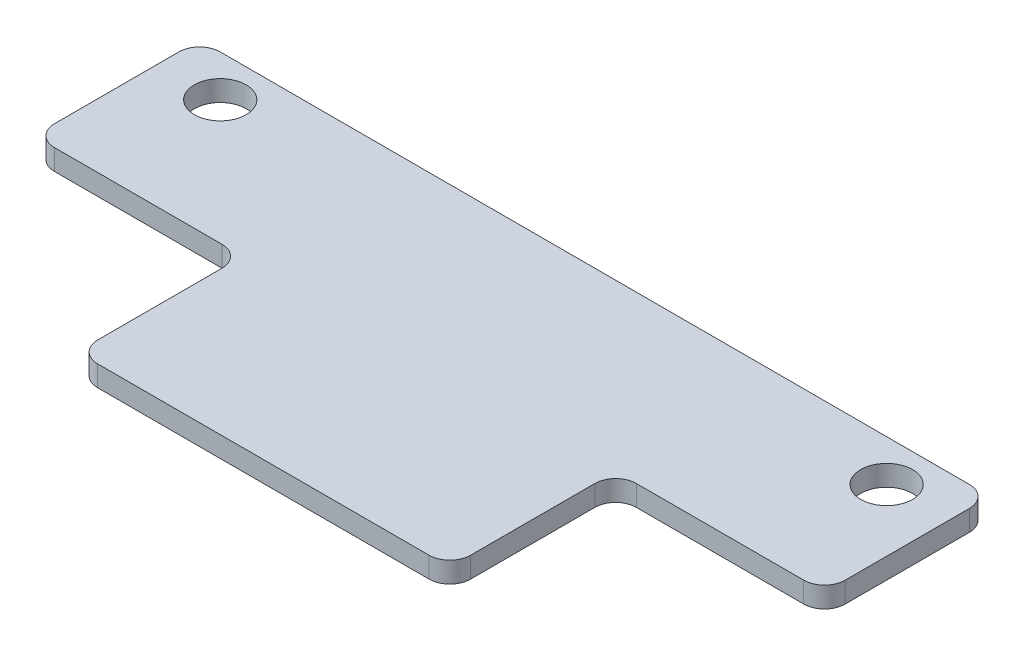
ISO-10303-21;
HEADER;
FILE_DESCRIPTION(('STEP AP214'),'2;1');
FILE_NAME('part.step','',(''),(''),'','','');
FILE_SCHEMA(('AUTOMOTIVE_DESIGN { 1 0 10303 214 1 1 1 1 }'));
ENDSEC;
DATA;
#1=APPLICATION_CONTEXT('core data for automotive mechanical design processes');
#2=APPLICATION_PROTOCOL_DEFINITION('international standard','automotive_design',2000,#1);
#3=PRODUCT_CONTEXT('',#1,'mechanical');
#4=PRODUCT('Part','Part','',(#3));
#5=PRODUCT_RELATED_PRODUCT_CATEGORY('part','',(#4));
#6=PRODUCT_DEFINITION_FORMATION('','',#4);
#7=PRODUCT_DEFINITION_CONTEXT('part definition',#1,'design');
#8=PRODUCT_DEFINITION('design','',#6,#7);
#9=PRODUCT_DEFINITION_SHAPE('','',#8);
#10=(LENGTH_UNIT() NAMED_UNIT(*) SI_UNIT(.MILLI.,.METRE.));
#11=(NAMED_UNIT(*) PLANE_ANGLE_UNIT() SI_UNIT($,.RADIAN.));
#12=(NAMED_UNIT(*) SI_UNIT($,.STERADIAN.) SOLID_ANGLE_UNIT());
#13=UNCERTAINTY_MEASURE_WITH_UNIT(LENGTH_MEASURE(1.E-05),#10,'distance_accuracy_value','');
#14=(GEOMETRIC_REPRESENTATION_CONTEXT(3) GLOBAL_UNCERTAINTY_ASSIGNED_CONTEXT((#13)) GLOBAL_UNIT_ASSIGNED_CONTEXT((#10,
#11,#12)) REPRESENTATION_CONTEXT('',''));
#15=CARTESIAN_POINT('',(0.,0.,0.));
#16=DIRECTION('',(0.,0.,1.));
#17=DIRECTION('',(1.,0.,0.));
#18=AXIS2_PLACEMENT_3D('',#15,#16,#17);
#19=CARTESIAN_POINT('',(0.,3.175,101.6));
#20=DIRECTION('',(0.,0.,-1.));
#21=DIRECTION('',(-1.,0.,0.));
#22=AXIS2_PLACEMENT_3D('',#19,#20,#21);
#23=PLANE('',#22);
#24=DIRECTION('',(1.,0.,0.));
#25=VECTOR('',#24,1.);
#26=CARTESIAN_POINT('',(0.,-3.175,101.6));
#27=LINE('',#26,#25);
#28=CARTESIAN_POINT('',(-50.8000000000245,-3.175,101.6));
#29=VERTEX_POINT('',#28);
#30=CARTESIAN_POINT('',(50.7999999999755,-3.175,101.6));
#31=VERTEX_POINT('',#30);
#32=EDGE_CURVE('E288',#29,#31,#27,.T.);
#33=ORIENTED_EDGE('',*,*,#32,.T.);
#34=DIRECTION('',(0.,1.,0.));
#35=VECTOR('',#34,1.);
#36=CARTESIAN_POINT('',(50.7999999999755,3.175,101.6));
#37=LINE('',#36,#35);
#38=CARTESIAN_POINT('',(50.7999999999755,3.175,101.6));
#39=VERTEX_POINT('',#38);
#40=EDGE_CURVE('E169',#31,#39,#37,.T.);
#41=ORIENTED_EDGE('',*,*,#40,.T.);
#42=DIRECTION('',(1.,0.,0.));
#43=VECTOR('',#42,1.);
#44=CARTESIAN_POINT('',(0.,3.175,101.6));
#45=LINE('',#44,#43);
#46=CARTESIAN_POINT('',(-50.8000000000245,3.175,101.6));
#47=VERTEX_POINT('',#46);
#48=EDGE_CURVE('E153',#47,#39,#45,.T.);
#49=ORIENTED_EDGE('',*,*,#48,.F.);
#50=DIRECTION('',(0.,1.,0.));
#51=VECTOR('',#50,1.);
#52=CARTESIAN_POINT('',(-50.8000000000245,3.175,101.6));
#53=LINE('',#52,#51);
#54=EDGE_CURVE('E166',#47,#29,#53,.F.);
#55=ORIENTED_EDGE('',*,*,#54,.T.);
#56=EDGE_LOOP('',(#33,#41,#49,#55));
#57=FACE_BOUND('',#56,.T.);
#58=ADVANCED_FACE('F35',(#57),#23,.F.);
#59=CARTESIAN_POINT('',(121.18154967239,3.175,0.));
#60=DIRECTION('',(1.,0.,0.));
#61=DIRECTION('',(0.,0.,-1.));
#62=AXIS2_PLACEMENT_3D('',#59,#60,#61);
#63=PLANE('',#62);
#64=DIRECTION('',(0.,0.,1.));
#65=VECTOR('',#64,1.);
#66=CARTESIAN_POINT('',(121.18154967239,-3.175,0.));
#67=LINE('',#66,#65);
#68=CARTESIAN_POINT('',(121.18154967239,-3.175,6.35));
#69=VERTEX_POINT('',#68);
#70=CARTESIAN_POINT('',(121.18154967239,-3.175,44.45));
#71=VERTEX_POINT('',#70);
#72=EDGE_CURVE('E290',#69,#71,#67,.T.);
#73=ORIENTED_EDGE('',*,*,#72,.F.);
#74=DIRECTION('',(0.,-1.,0.));
#75=VECTOR('',#74,1.);
#76=CARTESIAN_POINT('',(121.18154967239,3.175,6.35));
#77=LINE('',#76,#75);
#78=CARTESIAN_POINT('',(121.18154967239,3.175,6.35));
#79=VERTEX_POINT('',#78);
#80=EDGE_CURVE('E231',#69,#79,#77,.F.);
#81=ORIENTED_EDGE('',*,*,#80,.T.);
#82=DIRECTION('',(0.,0.,1.));
#83=VECTOR('',#82,1.);
#84=CARTESIAN_POINT('',(121.18154967239,3.175,0.));
#85=LINE('',#84,#83);
#86=CARTESIAN_POINT('',(121.18154967239,3.175,44.45));
#87=VERTEX_POINT('',#86);
#88=EDGE_CURVE('E170',#79,#87,#85,.T.);
#89=ORIENTED_EDGE('',*,*,#88,.T.);
#90=DIRECTION('',(0.,1.,0.));
#91=VECTOR('',#90,1.);
#92=CARTESIAN_POINT('',(121.18154967239,-3.175,44.45));
#93=LINE('',#92,#91);
#94=EDGE_CURVE('E229',#87,#71,#93,.F.);
#95=ORIENTED_EDGE('',*,*,#94,.T.);
#96=EDGE_LOOP('',(#73,#81,#89,#95));
#97=FACE_BOUND('',#96,.T.);
#98=ADVANCED_FACE('F314',(#97),#63,.T.);
#99=CARTESIAN_POINT('',(0.,3.175,0.));
#100=DIRECTION('',(0.,0.,-1.));
#101=DIRECTION('',(-1.,0.,0.));
#102=AXIS2_PLACEMENT_3D('',#99,#100,#101);
#103=PLANE('',#102);
#104=DIRECTION('',(1.,0.,0.));
#105=VECTOR('',#104,1.);
#106=CARTESIAN_POINT('',(0.,3.175,0.));
#107=LINE('',#106,#105);
#108=CARTESIAN_POINT('',(-114.83154967239,3.175,0.));
#109=VERTEX_POINT('',#108);
#110=CARTESIAN_POINT('',(114.83154967239,3.175,0.));
#111=VERTEX_POINT('',#110);
#112=EDGE_CURVE('E281',#109,#111,#107,.T.);
#113=ORIENTED_EDGE('',*,*,#112,.T.);
#114=DIRECTION('',(0.,-1.,0.));
#115=VECTOR('',#114,1.);
#116=CARTESIAN_POINT('',(114.83154967239,3.175,0.));
#117=LINE('',#116,#115);
#118=CARTESIAN_POINT('',(114.83154967239,-3.175,0.));
#119=VERTEX_POINT('',#118);
#120=EDGE_CURVE('E226',#111,#119,#117,.T.);
#121=ORIENTED_EDGE('',*,*,#120,.T.);
#122=DIRECTION('',(1.,0.,0.));
#123=VECTOR('',#122,1.);
#124=CARTESIAN_POINT('',(0.,-3.175,0.));
#125=LINE('',#124,#123);
#126=CARTESIAN_POINT('',(-114.83154967239,-3.175,0.));
#127=VERTEX_POINT('',#126);
#128=EDGE_CURVE('E292',#127,#119,#125,.T.);
#129=ORIENTED_EDGE('',*,*,#128,.F.);
#130=DIRECTION('',(0.,-1.,0.));
#131=VECTOR('',#130,1.);
#132=CARTESIAN_POINT('',(-114.83154967239,3.175,0.));
#133=LINE('',#132,#131);
#134=EDGE_CURVE('E224',#127,#109,#133,.F.);
#135=ORIENTED_EDGE('',*,*,#134,.T.);
#136=EDGE_LOOP('',(#113,#121,#129,#135));
#137=FACE_BOUND('',#136,.T.);
#138=ADVANCED_FACE('F319',(#137),#103,.T.);
#139=CARTESIAN_POINT('',(-121.18154967239,3.175,0.));
#140=DIRECTION('',(1.,0.,0.));
#141=DIRECTION('',(0.,0.,-1.));
#142=AXIS2_PLACEMENT_3D('',#139,#140,#141);
#143=PLANE('',#142);
#144=DIRECTION('',(0.,0.,1.));
#145=VECTOR('',#144,1.);
#146=CARTESIAN_POINT('',(-121.18154967239,-3.175,0.));
#147=LINE('',#146,#145);
#148=CARTESIAN_POINT('',(-121.18154967239,-3.175,6.35));
#149=VERTEX_POINT('',#148);
#150=CARTESIAN_POINT('',(-121.18154967239,-3.175,44.45));
#151=VERTEX_POINT('',#150);
#152=EDGE_CURVE('E294',#149,#151,#147,.T.);
#153=ORIENTED_EDGE('',*,*,#152,.T.);
#154=DIRECTION('',(0.,1.,0.));
#155=VECTOR('',#154,1.);
#156=CARTESIAN_POINT('',(-121.18154967239,3.175,44.45));
#157=LINE('',#156,#155);
#158=CARTESIAN_POINT('',(-121.18154967239,3.175,44.45));
#159=VERTEX_POINT('',#158);
#160=EDGE_CURVE('E221',#151,#159,#157,.T.);
#161=ORIENTED_EDGE('',*,*,#160,.T.);
#162=DIRECTION('',(0.,0.,1.));
#163=VECTOR('',#162,1.);
#164=CARTESIAN_POINT('',(-121.18154967239,3.175,0.));
#165=LINE('',#164,#163);
#166=CARTESIAN_POINT('',(-121.18154967239,3.175,6.35));
#167=VERTEX_POINT('',#166);
#168=EDGE_CURVE('E181',#167,#159,#165,.T.);
#169=ORIENTED_EDGE('',*,*,#168,.F.);
#170=DIRECTION('',(0.,-1.,0.));
#171=VECTOR('',#170,1.);
#172=CARTESIAN_POINT('',(-121.18154967239,-3.175,6.35));
#173=LINE('',#172,#171);
#174=EDGE_CURVE('E218',#167,#149,#173,.T.);
#175=ORIENTED_EDGE('',*,*,#174,.T.);
#176=EDGE_LOOP('',(#153,#161,#169,#175));
#177=FACE_BOUND('',#176,.T.);
#178=ADVANCED_FACE('F327',(#177),#143,.F.);
#179=CARTESIAN_POINT('',(-102.13154967239,3.175,12.7));
#180=DIRECTION('',(0.,-1.,0.));
#181=DIRECTION('',(0.,0.,-1.));
#182=AXIS2_PLACEMENT_3D('',#179,#180,#181);
#183=CYLINDRICAL_SURFACE('',#182,7.93749999999999);
#184=CARTESIAN_POINT('',(-102.13154967239,3.175,12.7));
#185=DIRECTION('',(0.,1.,0.));
#186=DIRECTION('',(0.,0.,1.));
#187=AXIS2_PLACEMENT_3D('',#184,#185,#186);
#188=CIRCLE('',#187,7.93749999999999);
#189=CARTESIAN_POINT('',(-102.13154967239,3.175,20.6375));
#190=VERTEX_POINT('',#189);
#191=EDGE_CURVE('E171',#190,#190,#188,.T.);
#192=ORIENTED_EDGE('',*,*,#191,.T.);
#193=EDGE_LOOP('',(#192));
#194=FACE_BOUND('',#193,.T.);
#195=CARTESIAN_POINT('',(-102.13154967239,-3.175,12.7));
#196=DIRECTION('',(0.,1.,0.));
#197=DIRECTION('',(0.,0.,1.));
#198=AXIS2_PLACEMENT_3D('',#195,#196,#197);
#199=CIRCLE('',#198,7.93749999999999);
#200=CARTESIAN_POINT('',(-102.13154967239,-3.175,20.6375));
#201=VERTEX_POINT('',#200);
#202=EDGE_CURVE('E273',#201,#201,#199,.T.);
#203=ORIENTED_EDGE('',*,*,#202,.F.);
#204=EDGE_LOOP('',(#203));
#205=FACE_BOUND('',#204,.T.);
#206=ADVANCED_FACE('F324',(#194,#205),#183,.F.);
#207=CARTESIAN_POINT('',(102.13154967239,3.175,12.7));
#208=DIRECTION('',(0.,-1.,0.));
#209=DIRECTION('',(0.,0.,-1.));
#210=AXIS2_PLACEMENT_3D('',#207,#208,#209);
#211=CYLINDRICAL_SURFACE('',#210,7.93749999999999);
#212=CARTESIAN_POINT('',(102.13154967239,3.175,12.7));
#213=DIRECTION('',(0.,1.,0.));
#214=DIRECTION('',(0.,0.,1.));
#215=AXIS2_PLACEMENT_3D('',#212,#213,#214);
#216=CIRCLE('',#215,7.93749999999999);
#217=CARTESIAN_POINT('',(102.13154967239,3.175,20.6375));
#218=VERTEX_POINT('',#217);
#219=EDGE_CURVE('E176',#218,#218,#216,.F.);
#220=ORIENTED_EDGE('',*,*,#219,.F.);
#221=EDGE_LOOP('',(#220));
#222=FACE_BOUND('',#221,.T.);
#223=CARTESIAN_POINT('',(102.13154967239,-3.175,12.7));
#224=DIRECTION('',(0.,1.,0.));
#225=DIRECTION('',(0.,0.,1.));
#226=AXIS2_PLACEMENT_3D('',#223,#224,#225);
#227=CIRCLE('',#226,7.93749999999999);
#228=CARTESIAN_POINT('',(102.13154967239,-3.175,20.6375));
#229=VERTEX_POINT('',#228);
#230=EDGE_CURVE('E184',#229,#229,#227,.F.);
#231=ORIENTED_EDGE('',*,*,#230,.T.);
#232=EDGE_LOOP('',(#231));
#233=FACE_BOUND('',#232,.T.);
#234=ADVANCED_FACE('F302',(#222,#233),#211,.F.);
#235=CARTESIAN_POINT('',(0.,3.175,0.));
#236=DIRECTION('',(0.,1.,0.));
#237=DIRECTION('',(0.,0.,1.));
#238=AXIS2_PLACEMENT_3D('',#235,#236,#237);
#239=PLANE('',#238);
#240=ORIENTED_EDGE('',*,*,#48,.T.);
#241=CARTESIAN_POINT('',(50.7999999999755,3.175,95.25));
#242=DIRECTION('',(0.,1.,0.));
#243=DIRECTION('',(0.,0.,1.));
#244=AXIS2_PLACEMENT_3D('',#241,#242,#243);
#245=CIRCLE('',#244,6.35);
#246=CARTESIAN_POINT('',(57.1499999999755,3.175,95.25));
#247=VERTEX_POINT('',#246);
#248=EDGE_CURVE('E160',#39,#247,#245,.T.);
#249=ORIENTED_EDGE('',*,*,#248,.T.);
#250=DIRECTION('',(0.,0.,1.));
#251=VECTOR('',#250,1.);
#252=CARTESIAN_POINT('',(57.1499999999755,3.175,50.8));
#253=LINE('',#252,#251);
#254=CARTESIAN_POINT('',(57.1499999999755,3.175,57.15));
#255=VERTEX_POINT('',#254);
#256=EDGE_CURVE('E244',#255,#247,#253,.T.);
#257=ORIENTED_EDGE('',*,*,#256,.F.);
#258=CARTESIAN_POINT('',(63.4999999999755,3.175,57.15));
#259=DIRECTION('',(0.,1.,0.));
#260=DIRECTION('',(0.,0.,1.));
#261=AXIS2_PLACEMENT_3D('',#258,#259,#260);
#262=CIRCLE('',#261,6.35);
#263=CARTESIAN_POINT('',(63.4999999999755,3.175,50.8));
#264=VERTEX_POINT('',#263);
#265=EDGE_CURVE('E43',#255,#264,#262,.F.);
#266=ORIENTED_EDGE('',*,*,#265,.T.);
#267=DIRECTION('',(-1.,0.,0.));
#268=VECTOR('',#267,1.);
#269=CARTESIAN_POINT('',(121.181549672341,3.175,50.8));
#270=LINE('',#269,#268);
#271=CARTESIAN_POINT('',(114.83154967239,3.175,50.8));
#272=VERTEX_POINT('',#271);
#273=EDGE_CURVE('E242',#272,#264,#270,.T.);
#274=ORIENTED_EDGE('',*,*,#273,.F.);
#275=CARTESIAN_POINT('',(114.83154967239,3.175,44.45));
#276=DIRECTION('',(0.,1.,0.));
#277=DIRECTION('',(0.,0.,1.));
#278=AXIS2_PLACEMENT_3D('',#275,#276,#277);
#279=CIRCLE('',#278,6.35);
#280=EDGE_CURVE('E188',#272,#87,#279,.T.);
#281=ORIENTED_EDGE('',*,*,#280,.T.);
#282=ORIENTED_EDGE('',*,*,#88,.F.);
#283=CARTESIAN_POINT('',(114.83154967239,3.175,6.35));
#284=DIRECTION('',(0.,1.,0.));
#285=DIRECTION('',(0.,0.,1.));
#286=AXIS2_PLACEMENT_3D('',#283,#284,#285);
#287=CIRCLE('',#286,6.35);
#288=EDGE_CURVE('E190',#79,#111,#287,.T.);
#289=ORIENTED_EDGE('',*,*,#288,.T.);
#290=ORIENTED_EDGE('',*,*,#112,.F.);
#291=CARTESIAN_POINT('',(-114.83154967239,3.175,6.35));
#292=DIRECTION('',(0.,1.,0.));
#293=DIRECTION('',(0.,0.,1.));
#294=AXIS2_PLACEMENT_3D('',#291,#292,#293);
#295=CIRCLE('',#294,6.35);
#296=EDGE_CURVE('E178',#109,#167,#295,.T.);
#297=ORIENTED_EDGE('',*,*,#296,.T.);
#298=ORIENTED_EDGE('',*,*,#168,.T.);
#299=CARTESIAN_POINT('',(-114.83154967239,3.175,44.45));
#300=DIRECTION('',(0.,1.,0.));
#301=DIRECTION('',(0.,0.,1.));
#302=AXIS2_PLACEMENT_3D('',#299,#300,#301);
#303=CIRCLE('',#302,6.35);
#304=CARTESIAN_POINT('',(-114.83154967239,3.175,50.8));
#305=VERTEX_POINT('',#304);
#306=EDGE_CURVE('E161',#159,#305,#303,.T.);
#307=ORIENTED_EDGE('',*,*,#306,.T.);
#308=DIRECTION('',(-1.,0.,0.));
#309=VECTOR('',#308,1.);
#310=CARTESIAN_POINT('',(-121.18154967239,3.175,50.8));
#311=LINE('',#310,#309);
#312=CARTESIAN_POINT('',(-63.5000000000245,3.175,50.8));
#313=VERTEX_POINT('',#312);
#314=EDGE_CURVE('E263',#313,#305,#311,.T.);
#315=ORIENTED_EDGE('',*,*,#314,.F.);
#316=CARTESIAN_POINT('',(-63.5000000000245,3.175,57.15));
#317=DIRECTION('',(0.,1.,0.));
#318=DIRECTION('',(0.,0.,1.));
#319=AXIS2_PLACEMENT_3D('',#316,#317,#318);
#320=CIRCLE('',#319,6.35);
#321=CARTESIAN_POINT('',(-57.1500000000245,3.175,57.15));
#322=VERTEX_POINT('',#321);
#323=EDGE_CURVE('E237',#313,#322,#320,.F.);
#324=ORIENTED_EDGE('',*,*,#323,.T.);
#325=DIRECTION('',(0.,0.,-1.));
#326=VECTOR('',#325,1.);
#327=CARTESIAN_POINT('',(-57.1500000000245,3.175,50.8));
#328=LINE('',#327,#326);
#329=CARTESIAN_POINT('',(-57.1500000000245,3.175,95.25));
#330=VERTEX_POINT('',#329);
#331=EDGE_CURVE('E155',#330,#322,#328,.T.);
#332=ORIENTED_EDGE('',*,*,#331,.F.);
#333=CARTESIAN_POINT('',(-50.8000000000245,3.175,95.25));
#334=DIRECTION('',(0.,1.,0.));
#335=DIRECTION('',(0.,0.,1.));
#336=AXIS2_PLACEMENT_3D('',#333,#334,#335);
#337=CIRCLE('',#336,6.35);
#338=EDGE_CURVE('E149',#330,#47,#337,.T.);
#339=ORIENTED_EDGE('',*,*,#338,.T.);
#340=EDGE_LOOP('',(#240,#249,#257,#266,#274,#281,#282,#289,#290,#297,#298,#307,#315,#324,#332,#339));
#341=FACE_BOUND('',#340,.T.);
#342=ORIENTED_EDGE('',*,*,#191,.F.);
#343=EDGE_LOOP('',(#342));
#344=FACE_BOUND('',#343,.T.);
#345=ORIENTED_EDGE('',*,*,#219,.T.);
#346=EDGE_LOOP('',(#345));
#347=FACE_BOUND('',#346,.T.);
#348=ADVANCED_FACE('F151',(#341,#344,#347),#239,.T.);
#349=CARTESIAN_POINT('',(0.,-3.175,0.));
#350=DIRECTION('',(0.,1.,0.));
#351=DIRECTION('',(0.,0.,1.));
#352=AXIS2_PLACEMENT_3D('',#349,#350,#351);
#353=PLANE('',#352);
#354=ORIENTED_EDGE('',*,*,#202,.T.);
#355=EDGE_LOOP('',(#354));
#356=FACE_BOUND('',#355,.T.);
#357=DIRECTION('',(0.,0.,1.));
#358=VECTOR('',#357,1.);
#359=CARTESIAN_POINT('',(57.1499999999755,-3.175,50.8));
#360=LINE('',#359,#358);
#361=CARTESIAN_POINT('',(57.1499999999755,-3.175,57.15));
#362=VERTEX_POINT('',#361);
#363=CARTESIAN_POINT('',(57.1499999999755,-3.175,95.25));
#364=VERTEX_POINT('',#363);
#365=EDGE_CURVE('E256',#362,#364,#360,.T.);
#366=ORIENTED_EDGE('',*,*,#365,.T.);
#367=CARTESIAN_POINT('',(50.7999999999755,-3.175,95.25));
#368=DIRECTION('',(0.,1.,0.));
#369=DIRECTION('',(0.,0.,1.));
#370=AXIS2_PLACEMENT_3D('',#367,#368,#369);
#371=CIRCLE('',#370,6.35);
#372=EDGE_CURVE('E207',#364,#31,#371,.F.);
#373=ORIENTED_EDGE('',*,*,#372,.T.);
#374=ORIENTED_EDGE('',*,*,#32,.F.);
#375=CARTESIAN_POINT('',(-50.8000000000245,-3.175,95.25));
#376=DIRECTION('',(0.,1.,0.));
#377=DIRECTION('',(0.,0.,1.));
#378=AXIS2_PLACEMENT_3D('',#375,#376,#377);
#379=CIRCLE('',#378,6.35);
#380=CARTESIAN_POINT('',(-57.1500000000245,-3.175,95.25));
#381=VERTEX_POINT('',#380);
#382=EDGE_CURVE('E175',#29,#381,#379,.F.);
#383=ORIENTED_EDGE('',*,*,#382,.T.);
#384=DIRECTION('',(0.,0.,-1.));
#385=VECTOR('',#384,1.);
#386=CARTESIAN_POINT('',(-57.1500000000245,-3.175,50.8));
#387=LINE('',#386,#385);
#388=CARTESIAN_POINT('',(-57.1500000000245,-3.175,57.15));
#389=VERTEX_POINT('',#388);
#390=EDGE_CURVE('E268',#381,#389,#387,.T.);
#391=ORIENTED_EDGE('',*,*,#390,.T.);
#392=CARTESIAN_POINT('',(-63.5000000000245,-3.175,57.15));
#393=DIRECTION('',(0.,1.,0.));
#394=DIRECTION('',(0.,0.,1.));
#395=AXIS2_PLACEMENT_3D('',#392,#393,#394);
#396=CIRCLE('',#395,6.35);
#397=CARTESIAN_POINT('',(-63.5000000000245,-3.175,50.8));
#398=VERTEX_POINT('',#397);
#399=EDGE_CURVE('E239',#389,#398,#396,.T.);
#400=ORIENTED_EDGE('',*,*,#399,.T.);
#401=DIRECTION('',(-1.,0.,0.));
#402=VECTOR('',#401,1.);
#403=CARTESIAN_POINT('',(-121.18154967239,-3.175,50.8));
#404=LINE('',#403,#402);
#405=CARTESIAN_POINT('',(-114.83154967239,-3.175,50.8));
#406=VERTEX_POINT('',#405);
#407=EDGE_CURVE('E271',#398,#406,#404,.T.);
#408=ORIENTED_EDGE('',*,*,#407,.T.);
#409=CARTESIAN_POINT('',(-114.83154967239,-3.175,44.45));
#410=DIRECTION('',(0.,1.,0.));
#411=DIRECTION('',(0.,0.,1.));
#412=AXIS2_PLACEMENT_3D('',#409,#410,#411);
#413=CIRCLE('',#412,6.35);
#414=EDGE_CURVE('E204',#406,#151,#413,.F.);
#415=ORIENTED_EDGE('',*,*,#414,.T.);
#416=ORIENTED_EDGE('',*,*,#152,.F.);
#417=CARTESIAN_POINT('',(-114.83154967239,-3.175,6.35));
#418=DIRECTION('',(0.,1.,0.));
#419=DIRECTION('',(0.,0.,1.));
#420=AXIS2_PLACEMENT_3D('',#417,#418,#419);
#421=CIRCLE('',#420,6.35);
#422=EDGE_CURVE('E199',#149,#127,#421,.F.);
#423=ORIENTED_EDGE('',*,*,#422,.T.);
#424=ORIENTED_EDGE('',*,*,#128,.T.);
#425=CARTESIAN_POINT('',(114.83154967239,-3.175,6.35));
#426=DIRECTION('',(0.,1.,0.));
#427=DIRECTION('',(0.,0.,1.));
#428=AXIS2_PLACEMENT_3D('',#425,#426,#427);
#429=CIRCLE('',#428,6.35);
#430=EDGE_CURVE('E202',#119,#69,#429,.F.);
#431=ORIENTED_EDGE('',*,*,#430,.T.);
#432=ORIENTED_EDGE('',*,*,#72,.T.);
#433=CARTESIAN_POINT('',(114.83154967239,-3.175,44.45));
#434=DIRECTION('',(0.,1.,0.));
#435=DIRECTION('',(0.,0.,1.));
#436=AXIS2_PLACEMENT_3D('',#433,#434,#435);
#437=CIRCLE('',#436,6.35);
#438=CARTESIAN_POINT('',(114.83154967239,-3.175,50.8));
#439=VERTEX_POINT('',#438);
#440=EDGE_CURVE('E57',#71,#439,#437,.F.);
#441=ORIENTED_EDGE('',*,*,#440,.T.);
#442=DIRECTION('',(-1.,0.,0.));
#443=VECTOR('',#442,1.);
#444=CARTESIAN_POINT('',(121.181549672341,-3.175,50.8));
#445=LINE('',#444,#443);
#446=CARTESIAN_POINT('',(63.4999999999755,-3.175,50.8));
#447=VERTEX_POINT('',#446);
#448=EDGE_CURVE('E258',#439,#447,#445,.T.);
#449=ORIENTED_EDGE('',*,*,#448,.T.);
#450=CARTESIAN_POINT('',(63.4999999999755,-3.175,57.15));
#451=DIRECTION('',(0.,1.,0.));
#452=DIRECTION('',(0.,0.,1.));
#453=AXIS2_PLACEMENT_3D('',#450,#451,#452);
#454=CIRCLE('',#453,6.35);
#455=EDGE_CURVE('E11',#447,#362,#454,.T.);
#456=ORIENTED_EDGE('',*,*,#455,.T.);
#457=EDGE_LOOP('',(#366,#373,#374,#383,#391,#400,#408,#415,#416,#423,#424,#431,#432,#441,#449,#456));
#458=FACE_BOUND('',#457,.T.);
#459=ORIENTED_EDGE('',*,*,#230,.F.);
#460=EDGE_LOOP('',(#459));
#461=FACE_BOUND('',#460,.T.);
#462=ADVANCED_FACE('F254',(#356,#458,#461),#353,.F.);
#463=CARTESIAN_POINT('',(57.1499999999755,-3.175,50.8));
#464=DIRECTION('',(-1.,0.,0.));
#465=DIRECTION('',(0.,0.,1.));
#466=AXIS2_PLACEMENT_3D('',#463,#464,#465);
#467=PLANE('',#466);
#468=ORIENTED_EDGE('',*,*,#256,.T.);
#469=DIRECTION('',(0.,1.,0.));
#470=VECTOR('',#469,1.);
#471=CARTESIAN_POINT('',(57.1499999999755,-3.175,95.25));
#472=LINE('',#471,#470);
#473=EDGE_CURVE('E197',#247,#364,#472,.F.);
#474=ORIENTED_EDGE('',*,*,#473,.T.);
#475=ORIENTED_EDGE('',*,*,#365,.F.);
#476=DIRECTION('',(0.,1.,0.));
#477=VECTOR('',#476,1.);
#478=CARTESIAN_POINT('',(57.1499999999755,3.175,57.15));
#479=LINE('',#478,#477);
#480=EDGE_CURVE('E194',#362,#255,#479,.T.);
#481=ORIENTED_EDGE('',*,*,#480,.T.);
#482=EDGE_LOOP('',(#468,#474,#475,#481));
#483=FACE_BOUND('',#482,.T.);
#484=ADVANCED_FACE('F260',(#483),#467,.F.);
#485=CARTESIAN_POINT('',(121.181549672341,-3.175,50.8));
#486=DIRECTION('',(0.,0.,-1.));
#487=DIRECTION('',(-1.,0.,0.));
#488=AXIS2_PLACEMENT_3D('',#485,#486,#487);
#489=PLANE('',#488);
#490=ORIENTED_EDGE('',*,*,#448,.F.);
#491=DIRECTION('',(0.,1.,0.));
#492=VECTOR('',#491,1.);
#493=CARTESIAN_POINT('',(114.83154967239,3.175,50.8));
#494=LINE('',#493,#492);
#495=EDGE_CURVE('E234',#439,#272,#494,.T.);
#496=ORIENTED_EDGE('',*,*,#495,.T.);
#497=ORIENTED_EDGE('',*,*,#273,.T.);
#498=DIRECTION('',(0.,1.,0.));
#499=VECTOR('',#498,1.);
#500=CARTESIAN_POINT('',(63.4999999999755,-3.175,50.8));
#501=LINE('',#500,#499);
#502=EDGE_CURVE('E50',#264,#447,#501,.F.);
#503=ORIENTED_EDGE('',*,*,#502,.T.);
#504=EDGE_LOOP('',(#490,#496,#497,#503));
#505=FACE_BOUND('',#504,.T.);
#506=ADVANCED_FACE('F247',(#505),#489,.F.);
#507=CARTESIAN_POINT('',(-121.18154967239,-3.175,50.8));
#508=DIRECTION('',(0.,0.,-1.));
#509=DIRECTION('',(-1.,0.,0.));
#510=AXIS2_PLACEMENT_3D('',#507,#508,#509);
#511=PLANE('',#510);
#512=ORIENTED_EDGE('',*,*,#407,.F.);
#513=DIRECTION('',(0.,1.,0.));
#514=VECTOR('',#513,1.);
#515=CARTESIAN_POINT('',(-63.5000000000245,3.175,50.8));
#516=LINE('',#515,#514);
#517=EDGE_CURVE('E215',#398,#313,#516,.T.);
#518=ORIENTED_EDGE('',*,*,#517,.T.);
#519=ORIENTED_EDGE('',*,*,#314,.T.);
#520=DIRECTION('',(0.,1.,0.));
#521=VECTOR('',#520,1.);
#522=CARTESIAN_POINT('',(-114.83154967239,-3.175,50.8));
#523=LINE('',#522,#521);
#524=EDGE_CURVE('E213',#305,#406,#523,.F.);
#525=ORIENTED_EDGE('',*,*,#524,.T.);
#526=EDGE_LOOP('',(#512,#518,#519,#525));
#527=FACE_BOUND('',#526,.T.);
#528=ADVANCED_FACE('F368',(#527),#511,.F.);
#529=CARTESIAN_POINT('',(-57.1500000000245,-3.175,50.8));
#530=DIRECTION('',(1.,0.,0.));
#531=DIRECTION('',(0.,0.,-1.));
#532=AXIS2_PLACEMENT_3D('',#529,#530,#531);
#533=PLANE('',#532);
#534=ORIENTED_EDGE('',*,*,#390,.F.);
#535=DIRECTION('',(0.,1.,0.));
#536=VECTOR('',#535,1.);
#537=CARTESIAN_POINT('',(-57.1500000000245,-3.175,95.25));
#538=LINE('',#537,#536);
#539=EDGE_CURVE('E211',#381,#330,#538,.T.);
#540=ORIENTED_EDGE('',*,*,#539,.T.);
#541=ORIENTED_EDGE('',*,*,#331,.T.);
#542=DIRECTION('',(0.,1.,0.));
#543=VECTOR('',#542,1.);
#544=CARTESIAN_POINT('',(-57.1500000000245,-3.175,57.15));
#545=LINE('',#544,#543);
#546=EDGE_CURVE('E209',#322,#389,#545,.F.);
#547=ORIENTED_EDGE('',*,*,#546,.T.);
#548=EDGE_LOOP('',(#534,#540,#541,#547));
#549=FACE_BOUND('',#548,.T.);
#550=ADVANCED_FACE('F332',(#549),#533,.F.);
#551=CARTESIAN_POINT('',(50.7999999999755,3.175,95.25));
#552=DIRECTION('',(0.,1.,0.));
#553=DIRECTION('',(0.,0.,1.));
#554=AXIS2_PLACEMENT_3D('',#551,#552,#553);
#555=CYLINDRICAL_SURFACE('',#554,6.35);
#556=ORIENTED_EDGE('',*,*,#372,.F.);
#557=ORIENTED_EDGE('',*,*,#473,.F.);
#558=ORIENTED_EDGE('',*,*,#248,.F.);
#559=ORIENTED_EDGE('',*,*,#40,.F.);
#560=EDGE_LOOP('',(#556,#557,#558,#559));
#561=FACE_BOUND('',#560,.T.);
#562=ADVANCED_FACE('F329',(#561),#555,.T.);
#563=CARTESIAN_POINT('',(-50.8000000000245,-3.175,95.25));
#564=DIRECTION('',(0.,1.,0.));
#565=DIRECTION('',(0.,0.,1.));
#566=AXIS2_PLACEMENT_3D('',#563,#564,#565);
#567=CYLINDRICAL_SURFACE('',#566,6.35);
#568=ORIENTED_EDGE('',*,*,#382,.F.);
#569=ORIENTED_EDGE('',*,*,#54,.F.);
#570=ORIENTED_EDGE('',*,*,#338,.F.);
#571=ORIENTED_EDGE('',*,*,#539,.F.);
#572=EDGE_LOOP('',(#568,#569,#570,#571));
#573=FACE_BOUND('',#572,.T.);
#574=ADVANCED_FACE('F174',(#573),#567,.T.);
#575=CARTESIAN_POINT('',(-63.5000000000245,-3.175,57.15));
#576=DIRECTION('',(0.,-1.,0.));
#577=DIRECTION('',(0.,0.,-1.));
#578=AXIS2_PLACEMENT_3D('',#575,#576,#577);
#579=CYLINDRICAL_SURFACE('',#578,6.35);
#580=ORIENTED_EDGE('',*,*,#399,.F.);
#581=ORIENTED_EDGE('',*,*,#546,.F.);
#582=ORIENTED_EDGE('',*,*,#323,.F.);
#583=ORIENTED_EDGE('',*,*,#517,.F.);
#584=EDGE_LOOP('',(#580,#581,#582,#583));
#585=FACE_BOUND('',#584,.T.);
#586=ADVANCED_FACE('F336',(#585),#579,.F.);
#587=CARTESIAN_POINT('',(-114.83154967239,3.175,44.45));
#588=DIRECTION('',(0.,1.,0.));
#589=DIRECTION('',(0.,0.,1.));
#590=AXIS2_PLACEMENT_3D('',#587,#588,#589);
#591=CYLINDRICAL_SURFACE('',#590,6.35);
#592=ORIENTED_EDGE('',*,*,#414,.F.);
#593=ORIENTED_EDGE('',*,*,#524,.F.);
#594=ORIENTED_EDGE('',*,*,#306,.F.);
#595=ORIENTED_EDGE('',*,*,#160,.F.);
#596=EDGE_LOOP('',(#592,#593,#594,#595));
#597=FACE_BOUND('',#596,.T.);
#598=ADVANCED_FACE('F339',(#597),#591,.T.);
#599=CARTESIAN_POINT('',(114.83154967239,3.175,6.35));
#600=DIRECTION('',(0.,-1.,0.));
#601=DIRECTION('',(0.,0.,-1.));
#602=AXIS2_PLACEMENT_3D('',#599,#600,#601);
#603=CYLINDRICAL_SURFACE('',#602,6.35);
#604=ORIENTED_EDGE('',*,*,#288,.F.);
#605=ORIENTED_EDGE('',*,*,#80,.F.);
#606=ORIENTED_EDGE('',*,*,#430,.F.);
#607=ORIENTED_EDGE('',*,*,#120,.F.);
#608=EDGE_LOOP('',(#604,#605,#606,#607));
#609=FACE_BOUND('',#608,.T.);
#610=ADVANCED_FACE('F343',(#609),#603,.T.);
#611=CARTESIAN_POINT('',(114.83154967239,-3.175,44.45));
#612=DIRECTION('',(0.,-1.,0.));
#613=DIRECTION('',(0.,0.,-1.));
#614=AXIS2_PLACEMENT_3D('',#611,#612,#613);
#615=CYLINDRICAL_SURFACE('',#614,6.35);
#616=ORIENTED_EDGE('',*,*,#440,.F.);
#617=ORIENTED_EDGE('',*,*,#94,.F.);
#618=ORIENTED_EDGE('',*,*,#280,.F.);
#619=ORIENTED_EDGE('',*,*,#495,.F.);
#620=EDGE_LOOP('',(#616,#617,#618,#619));
#621=FACE_BOUND('',#620,.T.);
#622=ADVANCED_FACE('F347',(#621),#615,.T.);
#623=CARTESIAN_POINT('',(63.4999999999755,-3.175,57.15));
#624=DIRECTION('',(0.,-1.,0.));
#625=DIRECTION('',(0.,0.,-1.));
#626=AXIS2_PLACEMENT_3D('',#623,#624,#625);
#627=CYLINDRICAL_SURFACE('',#626,6.35);
#628=ORIENTED_EDGE('',*,*,#455,.F.);
#629=ORIENTED_EDGE('',*,*,#502,.F.);
#630=ORIENTED_EDGE('',*,*,#265,.F.);
#631=ORIENTED_EDGE('',*,*,#480,.F.);
#632=EDGE_LOOP('',(#628,#629,#630,#631));
#633=FACE_BOUND('',#632,.T.);
#634=ADVANCED_FACE('F251',(#633),#627,.F.);
#635=CARTESIAN_POINT('',(-114.83154967239,3.175,6.35));
#636=DIRECTION('',(0.,1.,0.));
#637=DIRECTION('',(0.,0.,1.));
#638=AXIS2_PLACEMENT_3D('',#635,#636,#637);
#639=CYLINDRICAL_SURFACE('',#638,6.35);
#640=ORIENTED_EDGE('',*,*,#296,.F.);
#641=ORIENTED_EDGE('',*,*,#134,.F.);
#642=ORIENTED_EDGE('',*,*,#422,.F.);
#643=ORIENTED_EDGE('',*,*,#174,.F.);
#644=EDGE_LOOP('',(#640,#641,#642,#643));
#645=FACE_BOUND('',#644,.T.);
#646=ADVANCED_FACE('F37',(#645),#639,.T.);
#647=CLOSED_SHELL('',(#58,#98,#138,#178,#206,#234,#348,#462,#484,#506,#528,#550,#562,#574,#586,
#598,#610,#622,#634,#646));
#648=MANIFOLD_SOLID_BREP('B2',#647);
#649=ADVANCED_BREP_SHAPE_REPRESENTATION('',(#18,#648),#14);
#650=SHAPE_DEFINITION_REPRESENTATION(#9,#649);
ENDSEC;
END-ISO-10303-21;
